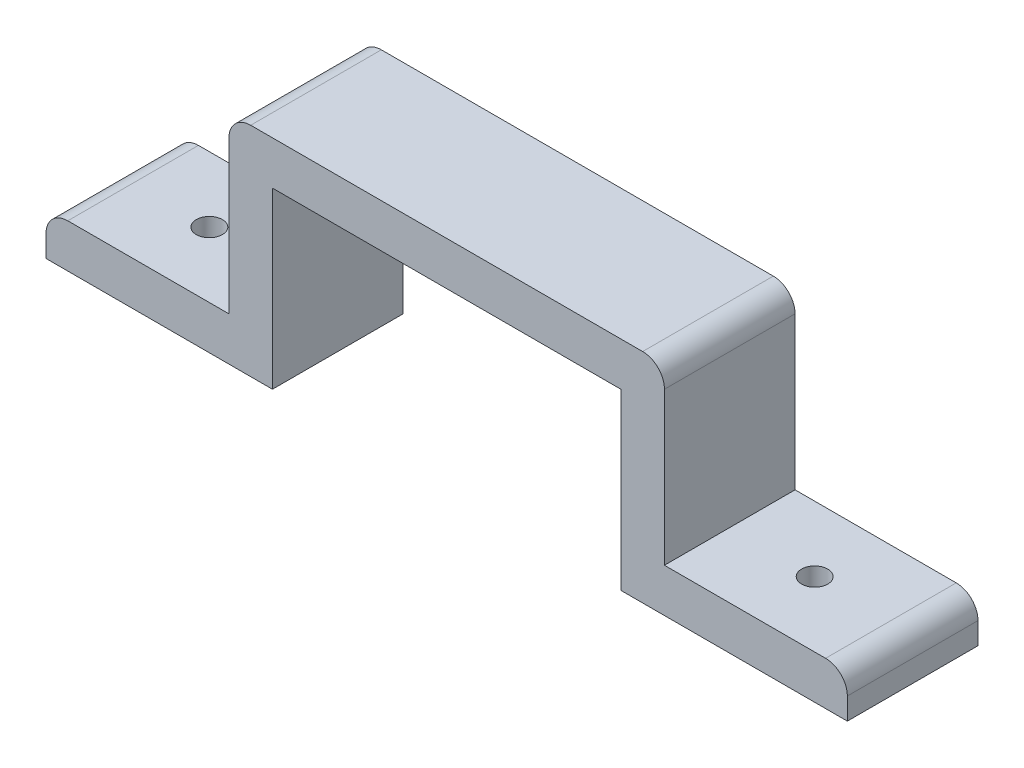
ISO-10303-21;
HEADER;
FILE_DESCRIPTION(('STEP AP214'),'2;1');
FILE_NAME('part.step','',(''),(''),'','','');
FILE_SCHEMA(('AUTOMOTIVE_DESIGN { 1 0 10303 214 1 1 1 1 }'));
ENDSEC;
DATA;
#1=APPLICATION_CONTEXT('core data for automotive mechanical design processes');
#2=APPLICATION_PROTOCOL_DEFINITION('international standard','automotive_design',2000,#1);
#3=PRODUCT_CONTEXT('',#1,'mechanical');
#4=PRODUCT('Part','Part','',(#3));
#5=PRODUCT_RELATED_PRODUCT_CATEGORY('part','',(#4));
#6=PRODUCT_DEFINITION_FORMATION('','',#4);
#7=PRODUCT_DEFINITION_CONTEXT('part definition',#1,'design');
#8=PRODUCT_DEFINITION('design','',#6,#7);
#9=PRODUCT_DEFINITION_SHAPE('','',#8);
#10=(LENGTH_UNIT() NAMED_UNIT(*) SI_UNIT(.MILLI.,.METRE.));
#11=(NAMED_UNIT(*) PLANE_ANGLE_UNIT() SI_UNIT($,.RADIAN.));
#12=(NAMED_UNIT(*) SI_UNIT($,.STERADIAN.) SOLID_ANGLE_UNIT());
#13=UNCERTAINTY_MEASURE_WITH_UNIT(LENGTH_MEASURE(1.E-05),#10,'distance_accuracy_value','');
#14=(GEOMETRIC_REPRESENTATION_CONTEXT(3) GLOBAL_UNCERTAINTY_ASSIGNED_CONTEXT((#13)) GLOBAL_UNIT_ASSIGNED_CONTEXT((#10,
#11,#12)) REPRESENTATION_CONTEXT('',''));
#15=CARTESIAN_POINT('',(0.,0.,0.));
#16=DIRECTION('',(0.,0.,1.));
#17=DIRECTION('',(1.,0.,0.));
#18=AXIS2_PLACEMENT_3D('',#15,#16,#17);
#19=CARTESIAN_POINT('',(-25.,5.,15.));
#20=DIRECTION('',(1.,0.,0.));
#21=DIRECTION('',(0.,0.,-1.));
#22=AXIS2_PLACEMENT_3D('',#19,#20,#21);
#23=PLANE('',#22);
#24=DIRECTION('',(0.,-1.,0.));
#25=VECTOR('',#24,1.);
#26=CARTESIAN_POINT('',(-25.,5.,15.));
#27=LINE('',#26,#25);
#28=CARTESIAN_POINT('',(-25.,22.5,15.));
#29=VERTEX_POINT('',#28);
#30=CARTESIAN_POINT('',(-25.,5.,15.));
#31=VERTEX_POINT('',#30);
#32=EDGE_CURVE('E147',#29,#31,#27,.T.);
#33=ORIENTED_EDGE('',*,*,#32,.F.);
#34=DIRECTION('',(0.,0.,-1.));
#35=VECTOR('',#34,1.);
#36=CARTESIAN_POINT('',(-25.,22.5,15.));
#37=LINE('',#36,#35);
#38=CARTESIAN_POINT('',(-25.,22.5,0.));
#39=VERTEX_POINT('',#38);
#40=EDGE_CURVE('E173',#29,#39,#37,.T.);
#41=ORIENTED_EDGE('',*,*,#40,.T.);
#42=DIRECTION('',(0.,-1.,0.));
#43=VECTOR('',#42,1.);
#44=CARTESIAN_POINT('',(-25.,5.,0.));
#45=LINE('',#44,#43);
#46=CARTESIAN_POINT('',(-25.,5.,0.));
#47=VERTEX_POINT('',#46);
#48=EDGE_CURVE('E171',#39,#47,#45,.T.);
#49=ORIENTED_EDGE('',*,*,#48,.T.);
#50=DIRECTION('',(0.,0.,-1.));
#51=VECTOR('',#50,1.);
#52=CARTESIAN_POINT('',(-25.,5.,15.));
#53=LINE('',#52,#51);
#54=EDGE_CURVE('E165',#31,#47,#53,.T.);
#55=ORIENTED_EDGE('',*,*,#54,.F.);
#56=EDGE_LOOP('',(#33,#41,#49,#55));
#57=FACE_BOUND('',#56,.T.);
#58=ADVANCED_FACE('F33',(#57),#23,.F.);
#59=CARTESIAN_POINT('',(-46.,5.,15.));
#60=DIRECTION('',(0.,-1.,0.));
#61=DIRECTION('',(0.,0.,-1.));
#62=AXIS2_PLACEMENT_3D('',#59,#60,#61);
#63=PLANE('',#62);
#64=CARTESIAN_POINT('',(-34.75,5.,7.5));
#65=DIRECTION('',(0.,1.,0.));
#66=DIRECTION('',(0.,0.,-1.));
#67=AXIS2_PLACEMENT_3D('',#64,#65,#66);
#68=CIRCLE('',#67,1.5);
#69=CARTESIAN_POINT('',(-34.75,5.,6.));
#70=VERTEX_POINT('',#69);
#71=EDGE_CURVE('E376',#70,#70,#68,.T.);
#72=ORIENTED_EDGE('',*,*,#71,.F.);
#73=EDGE_LOOP('',(#72));
#74=FACE_BOUND('',#73,.T.);
#75=DIRECTION('',(-1.,0.,0.));
#76=VECTOR('',#75,1.);
#77=CARTESIAN_POINT('',(-46.,5.,0.));
#78=LINE('',#77,#76);
#79=CARTESIAN_POINT('',(-43.5,5.,0.));
#80=VERTEX_POINT('',#79);
#81=EDGE_CURVE('E290',#47,#80,#78,.T.);
#82=ORIENTED_EDGE('',*,*,#81,.T.);
#83=DIRECTION('',(0.,0.,-1.));
#84=VECTOR('',#83,1.);
#85=CARTESIAN_POINT('',(-43.5,5.,15.));
#86=LINE('',#85,#84);
#87=CARTESIAN_POINT('',(-43.5,5.,15.));
#88=VERTEX_POINT('',#87);
#89=EDGE_CURVE('E167',#80,#88,#86,.F.);
#90=ORIENTED_EDGE('',*,*,#89,.T.);
#91=DIRECTION('',(-1.,0.,0.));
#92=VECTOR('',#91,1.);
#93=CARTESIAN_POINT('',(-46.,5.,15.));
#94=LINE('',#93,#92);
#95=EDGE_CURVE('E151',#31,#88,#94,.T.);
#96=ORIENTED_EDGE('',*,*,#95,.F.);
#97=ORIENTED_EDGE('',*,*,#54,.T.);
#98=EDGE_LOOP('',(#82,#90,#96,#97));
#99=FACE_BOUND('',#98,.T.);
#100=ADVANCED_FACE('F164',(#74,#99),#63,.F.);
#101=CARTESIAN_POINT('',(-46.,0.,15.));
#102=DIRECTION('',(1.,0.,0.));
#103=DIRECTION('',(0.,0.,-1.));
#104=AXIS2_PLACEMENT_3D('',#101,#102,#103);
#105=PLANE('',#104);
#106=DIRECTION('',(0.,-1.,0.));
#107=VECTOR('',#106,1.);
#108=CARTESIAN_POINT('',(-46.,0.,15.));
#109=LINE('',#108,#107);
#110=CARTESIAN_POINT('',(-46.,2.5,15.));
#111=VERTEX_POINT('',#110);
#112=CARTESIAN_POINT('',(-46.,0.,15.));
#113=VERTEX_POINT('',#112);
#114=EDGE_CURVE('E168',#111,#113,#109,.T.);
#115=ORIENTED_EDGE('',*,*,#114,.F.);
#116=DIRECTION('',(0.,0.,-1.));
#117=VECTOR('',#116,1.);
#118=CARTESIAN_POINT('',(-46.,2.5,15.));
#119=LINE('',#118,#117);
#120=CARTESIAN_POINT('',(-46.,2.5,0.));
#121=VERTEX_POINT('',#120);
#122=EDGE_CURVE('E202',#111,#121,#119,.T.);
#123=ORIENTED_EDGE('',*,*,#122,.T.);
#124=DIRECTION('',(0.,-1.,0.));
#125=VECTOR('',#124,1.);
#126=CARTESIAN_POINT('',(-46.,0.,0.));
#127=LINE('',#126,#125);
#128=CARTESIAN_POINT('',(-46.,0.,0.));
#129=VERTEX_POINT('',#128);
#130=EDGE_CURVE('E264',#121,#129,#127,.T.);
#131=ORIENTED_EDGE('',*,*,#130,.T.);
#132=DIRECTION('',(0.,0.,-1.));
#133=VECTOR('',#132,1.);
#134=CARTESIAN_POINT('',(-46.,0.,15.));
#135=LINE('',#134,#133);
#136=EDGE_CURVE('E174',#113,#129,#135,.T.);
#137=ORIENTED_EDGE('',*,*,#136,.F.);
#138=EDGE_LOOP('',(#115,#123,#131,#137));
#139=FACE_BOUND('',#138,.T.);
#140=ADVANCED_FACE('F295',(#139),#105,.F.);
#141=CARTESIAN_POINT('',(-20.,0.,15.));
#142=DIRECTION('',(0.,1.,0.));
#143=DIRECTION('',(0.,0.,1.));
#144=AXIS2_PLACEMENT_3D('',#141,#142,#143);
#145=PLANE('',#144);
#146=CARTESIAN_POINT('',(-34.75,0.,7.5));
#147=DIRECTION('',(0.,1.,0.));
#148=DIRECTION('',(0.,0.,1.));
#149=AXIS2_PLACEMENT_3D('',#146,#147,#148);
#150=CIRCLE('',#149,1.5);
#151=CARTESIAN_POINT('',(-34.75,0.,9.00000000000001));
#152=VERTEX_POINT('',#151);
#153=EDGE_CURVE('E373',#152,#152,#150,.F.);
#154=ORIENTED_EDGE('',*,*,#153,.F.);
#155=EDGE_LOOP('',(#154));
#156=FACE_BOUND('',#155,.T.);
#157=DIRECTION('',(1.,0.,0.));
#158=VECTOR('',#157,1.);
#159=CARTESIAN_POINT('',(-20.,0.,0.));
#160=LINE('',#159,#158);
#161=CARTESIAN_POINT('',(-20.,0.,0.));
#162=VERTEX_POINT('',#161);
#163=EDGE_CURVE('E258',#129,#162,#160,.T.);
#164=ORIENTED_EDGE('',*,*,#163,.T.);
#165=DIRECTION('',(0.,0.,-1.));
#166=VECTOR('',#165,1.);
#167=CARTESIAN_POINT('',(-20.,0.,15.));
#168=LINE('',#167,#166);
#169=CARTESIAN_POINT('',(-20.,0.,15.));
#170=VERTEX_POINT('',#169);
#171=EDGE_CURVE('E179',#170,#162,#168,.T.);
#172=ORIENTED_EDGE('',*,*,#171,.F.);
#173=DIRECTION('',(1.,0.,0.));
#174=VECTOR('',#173,1.);
#175=CARTESIAN_POINT('',(-20.,0.,15.));
#176=LINE('',#175,#174);
#177=EDGE_CURVE('E298',#113,#170,#176,.T.);
#178=ORIENTED_EDGE('',*,*,#177,.F.);
#179=ORIENTED_EDGE('',*,*,#136,.T.);
#180=EDGE_LOOP('',(#164,#172,#178,#179));
#181=FACE_BOUND('',#180,.T.);
#182=ADVANCED_FACE('F297',(#156,#181),#145,.F.);
#183=CARTESIAN_POINT('',(-20.,20.,15.));
#184=DIRECTION('',(-1.,0.,0.));
#185=DIRECTION('',(0.,-1.,0.));
#186=AXIS2_PLACEMENT_3D('',#183,#184,#185);
#187=PLANE('',#186);
#188=DIRECTION('',(0.,1.,0.));
#189=VECTOR('',#188,1.);
#190=CARTESIAN_POINT('',(-20.,20.,0.));
#191=LINE('',#190,#189);
#192=CARTESIAN_POINT('',(-20.,20.,0.));
#193=VERTEX_POINT('',#192);
#194=EDGE_CURVE('E251',#162,#193,#191,.T.);
#195=ORIENTED_EDGE('',*,*,#194,.T.);
#196=DIRECTION('',(0.,0.,-1.));
#197=VECTOR('',#196,1.);
#198=CARTESIAN_POINT('',(-20.,20.,15.));
#199=LINE('',#198,#197);
#200=CARTESIAN_POINT('',(-20.,20.,15.));
#201=VERTEX_POINT('',#200);
#202=EDGE_CURVE('E242',#201,#193,#199,.T.);
#203=ORIENTED_EDGE('',*,*,#202,.F.);
#204=DIRECTION('',(0.,1.,0.));
#205=VECTOR('',#204,1.);
#206=CARTESIAN_POINT('',(-20.,20.,15.));
#207=LINE('',#206,#205);
#208=EDGE_CURVE('E252',#170,#201,#207,.T.);
#209=ORIENTED_EDGE('',*,*,#208,.F.);
#210=ORIENTED_EDGE('',*,*,#171,.T.);
#211=EDGE_LOOP('',(#195,#203,#209,#210));
#212=FACE_BOUND('',#211,.T.);
#213=ADVANCED_FACE('F249',(#212),#187,.F.);
#214=CARTESIAN_POINT('',(20.,20.,15.));
#215=DIRECTION('',(0.,1.,0.));
#216=DIRECTION('',(0.,0.,1.));
#217=AXIS2_PLACEMENT_3D('',#214,#215,#216);
#218=PLANE('',#217);
#219=DIRECTION('',(1.,0.,0.));
#220=VECTOR('',#219,1.);
#221=CARTESIAN_POINT('',(20.,20.,0.));
#222=LINE('',#221,#220);
#223=CARTESIAN_POINT('',(20.,20.,0.));
#224=VERTEX_POINT('',#223);
#225=EDGE_CURVE('E260',#193,#224,#222,.T.);
#226=ORIENTED_EDGE('',*,*,#225,.T.);
#227=DIRECTION('',(0.,0.,-1.));
#228=VECTOR('',#227,1.);
#229=CARTESIAN_POINT('',(20.,20.,15.));
#230=LINE('',#229,#228);
#231=CARTESIAN_POINT('',(20.,20.,15.));
#232=VERTEX_POINT('',#231);
#233=EDGE_CURVE('E239',#232,#224,#230,.T.);
#234=ORIENTED_EDGE('',*,*,#233,.F.);
#235=DIRECTION('',(1.,0.,0.));
#236=VECTOR('',#235,1.);
#237=CARTESIAN_POINT('',(20.,20.,15.));
#238=LINE('',#237,#236);
#239=EDGE_CURVE('E300',#201,#232,#238,.T.);
#240=ORIENTED_EDGE('',*,*,#239,.F.);
#241=ORIENTED_EDGE('',*,*,#202,.T.);
#242=EDGE_LOOP('',(#226,#234,#240,#241));
#243=FACE_BOUND('',#242,.T.);
#244=ADVANCED_FACE('F310',(#243),#218,.F.);
#245=CARTESIAN_POINT('',(20.,20.,15.));
#246=DIRECTION('',(1.,0.,0.));
#247=DIRECTION('',(0.,1.,0.));
#248=AXIS2_PLACEMENT_3D('',#245,#246,#247);
#249=PLANE('',#248);
#250=DIRECTION('',(0.,-1.,0.));
#251=VECTOR('',#250,1.);
#252=CARTESIAN_POINT('',(20.,20.,0.));
#253=LINE('',#252,#251);
#254=CARTESIAN_POINT('',(20.,0.,0.));
#255=VERTEX_POINT('',#254);
#256=EDGE_CURVE('E262',#224,#255,#253,.T.);
#257=ORIENTED_EDGE('',*,*,#256,.T.);
#258=DIRECTION('',(0.,0.,-1.));
#259=VECTOR('',#258,1.);
#260=CARTESIAN_POINT('',(20.,0.,15.));
#261=LINE('',#260,#259);
#262=CARTESIAN_POINT('',(20.,0.,15.));
#263=VERTEX_POINT('',#262);
#264=EDGE_CURVE('E236',#263,#255,#261,.T.);
#265=ORIENTED_EDGE('',*,*,#264,.F.);
#266=DIRECTION('',(0.,-1.,0.));
#267=VECTOR('',#266,1.);
#268=CARTESIAN_POINT('',(20.,20.,15.));
#269=LINE('',#268,#267);
#270=EDGE_CURVE('E283',#232,#263,#269,.T.);
#271=ORIENTED_EDGE('',*,*,#270,.F.);
#272=ORIENTED_EDGE('',*,*,#233,.T.);
#273=EDGE_LOOP('',(#257,#265,#271,#272));
#274=FACE_BOUND('',#273,.T.);
#275=ADVANCED_FACE('F308',(#274),#249,.F.);
#276=CARTESIAN_POINT('',(20.,0.,15.));
#277=DIRECTION('',(0.,1.,0.));
#278=DIRECTION('',(0.,0.,1.));
#279=AXIS2_PLACEMENT_3D('',#276,#277,#278);
#280=PLANE('',#279);
#281=CARTESIAN_POINT('',(34.75,0.,7.5));
#282=DIRECTION('',(0.,1.,0.));
#283=DIRECTION('',(0.,0.,1.));
#284=AXIS2_PLACEMENT_3D('',#281,#282,#283);
#285=CIRCLE('',#284,1.5);
#286=CARTESIAN_POINT('',(34.75,0.,9.00000000000001));
#287=VERTEX_POINT('',#286);
#288=EDGE_CURVE('E291',#287,#287,#285,.F.);
#289=ORIENTED_EDGE('',*,*,#288,.F.);
#290=EDGE_LOOP('',(#289));
#291=FACE_BOUND('',#290,.T.);
#292=DIRECTION('',(1.,0.,0.));
#293=VECTOR('',#292,1.);
#294=CARTESIAN_POINT('',(20.,0.,0.));
#295=LINE('',#294,#293);
#296=CARTESIAN_POINT('',(46.,0.,0.));
#297=VERTEX_POINT('',#296);
#298=EDGE_CURVE('E224',#255,#297,#295,.T.);
#299=ORIENTED_EDGE('',*,*,#298,.T.);
#300=DIRECTION('',(0.,0.,-1.));
#301=VECTOR('',#300,1.);
#302=CARTESIAN_POINT('',(46.,0.,15.));
#303=LINE('',#302,#301);
#304=CARTESIAN_POINT('',(46.,0.,15.));
#305=VERTEX_POINT('',#304);
#306=EDGE_CURVE('E232',#305,#297,#303,.T.);
#307=ORIENTED_EDGE('',*,*,#306,.F.);
#308=DIRECTION('',(1.,0.,0.));
#309=VECTOR('',#308,1.);
#310=CARTESIAN_POINT('',(20.,0.,15.));
#311=LINE('',#310,#309);
#312=EDGE_CURVE('E279',#263,#305,#311,.T.);
#313=ORIENTED_EDGE('',*,*,#312,.F.);
#314=ORIENTED_EDGE('',*,*,#264,.T.);
#315=EDGE_LOOP('',(#299,#307,#313,#314));
#316=FACE_BOUND('',#315,.T.);
#317=ADVANCED_FACE('F271',(#291,#316),#280,.F.);
#318=CARTESIAN_POINT('',(46.,0.,15.));
#319=DIRECTION('',(-1.,0.,0.));
#320=DIRECTION('',(0.,0.,1.));
#321=AXIS2_PLACEMENT_3D('',#318,#319,#320);
#322=PLANE('',#321);
#323=DIRECTION('',(0.,1.,0.));
#324=VECTOR('',#323,1.);
#325=CARTESIAN_POINT('',(46.,0.,0.));
#326=LINE('',#325,#324);
#327=CARTESIAN_POINT('',(46.,2.5,0.));
#328=VERTEX_POINT('',#327);
#329=EDGE_CURVE('E221',#297,#328,#326,.T.);
#330=ORIENTED_EDGE('',*,*,#329,.T.);
#331=DIRECTION('',(0.,0.,-1.));
#332=VECTOR('',#331,1.);
#333=CARTESIAN_POINT('',(46.,2.5,15.));
#334=LINE('',#333,#332);
#335=CARTESIAN_POINT('',(46.,2.5,15.));
#336=VERTEX_POINT('',#335);
#337=EDGE_CURVE('E11',#328,#336,#334,.F.);
#338=ORIENTED_EDGE('',*,*,#337,.T.);
#339=DIRECTION('',(0.,1.,0.));
#340=VECTOR('',#339,1.);
#341=CARTESIAN_POINT('',(46.,0.,15.));
#342=LINE('',#341,#340);
#343=EDGE_CURVE('E278',#305,#336,#342,.T.);
#344=ORIENTED_EDGE('',*,*,#343,.F.);
#345=ORIENTED_EDGE('',*,*,#306,.T.);
#346=EDGE_LOOP('',(#330,#338,#344,#345));
#347=FACE_BOUND('',#346,.T.);
#348=ADVANCED_FACE('F276',(#347),#322,.F.);
#349=CARTESIAN_POINT('',(46.,5.,15.));
#350=DIRECTION('',(0.,-1.,0.));
#351=DIRECTION('',(0.,0.,-1.));
#352=AXIS2_PLACEMENT_3D('',#349,#350,#351);
#353=PLANE('',#352);
#354=CARTESIAN_POINT('',(34.75,5.,7.5));
#355=DIRECTION('',(0.,1.,0.));
#356=DIRECTION('',(0.,0.,1.));
#357=AXIS2_PLACEMENT_3D('',#354,#355,#356);
#358=CIRCLE('',#357,1.5);
#359=CARTESIAN_POINT('',(34.75,5.,9.00000000000001));
#360=VERTEX_POINT('',#359);
#361=EDGE_CURVE('E370',#360,#360,#358,.T.);
#362=ORIENTED_EDGE('',*,*,#361,.F.);
#363=EDGE_LOOP('',(#362));
#364=FACE_BOUND('',#363,.T.);
#365=DIRECTION('',(-1.,0.,0.));
#366=VECTOR('',#365,1.);
#367=CARTESIAN_POINT('',(46.,5.,15.));
#368=LINE('',#367,#366);
#369=CARTESIAN_POINT('',(43.5,5.,15.));
#370=VERTEX_POINT('',#369);
#371=CARTESIAN_POINT('',(25.,5.,15.));
#372=VERTEX_POINT('',#371);
#373=EDGE_CURVE('E213',#370,#372,#368,.T.);
#374=ORIENTED_EDGE('',*,*,#373,.F.);
#375=DIRECTION('',(0.,0.,-1.));
#376=VECTOR('',#375,1.);
#377=CARTESIAN_POINT('',(43.5,5.,15.));
#378=LINE('',#377,#376);
#379=CARTESIAN_POINT('',(43.5,5.,0.));
#380=VERTEX_POINT('',#379);
#381=EDGE_CURVE('E41',#370,#380,#378,.T.);
#382=ORIENTED_EDGE('',*,*,#381,.T.);
#383=DIRECTION('',(-1.,0.,0.));
#384=VECTOR('',#383,1.);
#385=CARTESIAN_POINT('',(46.,5.,0.));
#386=LINE('',#385,#384);
#387=CARTESIAN_POINT('',(25.,5.,0.));
#388=VERTEX_POINT('',#387);
#389=EDGE_CURVE('E211',#380,#388,#386,.T.);
#390=ORIENTED_EDGE('',*,*,#389,.T.);
#391=DIRECTION('',(0.,0.,-1.));
#392=VECTOR('',#391,1.);
#393=CARTESIAN_POINT('',(25.,5.,15.));
#394=LINE('',#393,#392);
#395=EDGE_CURVE('E230',#372,#388,#394,.T.);
#396=ORIENTED_EDGE('',*,*,#395,.F.);
#397=EDGE_LOOP('',(#374,#382,#390,#396));
#398=FACE_BOUND('',#397,.T.);
#399=ADVANCED_FACE('F209',(#364,#398),#353,.F.);
#400=CARTESIAN_POINT('',(25.,5.,15.));
#401=DIRECTION('',(-1.,0.,0.));
#402=DIRECTION('',(0.,0.,1.));
#403=AXIS2_PLACEMENT_3D('',#400,#401,#402);
#404=PLANE('',#403);
#405=DIRECTION('',(0.,1.,0.));
#406=VECTOR('',#405,1.);
#407=CARTESIAN_POINT('',(25.,5.,0.));
#408=LINE('',#407,#406);
#409=CARTESIAN_POINT('',(25.,22.5,0.));
#410=VERTEX_POINT('',#409);
#411=EDGE_CURVE('E220',#388,#410,#408,.T.);
#412=ORIENTED_EDGE('',*,*,#411,.T.);
#413=DIRECTION('',(0.,0.,-1.));
#414=VECTOR('',#413,1.);
#415=CARTESIAN_POINT('',(25.,22.5,15.));
#416=LINE('',#415,#414);
#417=CARTESIAN_POINT('',(25.,22.5,15.));
#418=VERTEX_POINT('',#417);
#419=EDGE_CURVE('E48',#410,#418,#416,.F.);
#420=ORIENTED_EDGE('',*,*,#419,.T.);
#421=DIRECTION('',(0.,1.,0.));
#422=VECTOR('',#421,1.);
#423=CARTESIAN_POINT('',(25.,5.,15.));
#424=LINE('',#423,#422);
#425=EDGE_CURVE('E281',#372,#418,#424,.T.);
#426=ORIENTED_EDGE('',*,*,#425,.F.);
#427=ORIENTED_EDGE('',*,*,#395,.T.);
#428=EDGE_LOOP('',(#412,#420,#426,#427));
#429=FACE_BOUND('',#428,.T.);
#430=ADVANCED_FACE('F349',(#429),#404,.F.);
#431=CARTESIAN_POINT('',(-25.,25.,15.));
#432=DIRECTION('',(0.,-1.,0.));
#433=DIRECTION('',(0.,0.,-1.));
#434=AXIS2_PLACEMENT_3D('',#431,#432,#433);
#435=PLANE('',#434);
#436=DIRECTION('',(-1.,0.,0.));
#437=VECTOR('',#436,1.);
#438=CARTESIAN_POINT('',(-25.,25.,0.));
#439=LINE('',#438,#437);
#440=CARTESIAN_POINT('',(22.5,25.,0.));
#441=VERTEX_POINT('',#440);
#442=CARTESIAN_POINT('',(-22.5,25.,0.));
#443=VERTEX_POINT('',#442);
#444=EDGE_CURVE('E159',#441,#443,#439,.T.);
#445=ORIENTED_EDGE('',*,*,#444,.T.);
#446=DIRECTION('',(0.,0.,-1.));
#447=VECTOR('',#446,1.);
#448=CARTESIAN_POINT('',(-22.5,25.,15.));
#449=LINE('',#448,#447);
#450=CARTESIAN_POINT('',(-22.5,25.,15.));
#451=VERTEX_POINT('',#450);
#452=EDGE_CURVE('E193',#443,#451,#449,.F.);
#453=ORIENTED_EDGE('',*,*,#452,.T.);
#454=DIRECTION('',(-1.,0.,0.));
#455=VECTOR('',#454,1.);
#456=CARTESIAN_POINT('',(-25.,25.,15.));
#457=LINE('',#456,#455);
#458=CARTESIAN_POINT('',(22.5,25.,15.));
#459=VERTEX_POINT('',#458);
#460=EDGE_CURVE('E233',#459,#451,#457,.T.);
#461=ORIENTED_EDGE('',*,*,#460,.F.);
#462=DIRECTION('',(0.,0.,-1.));
#463=VECTOR('',#462,1.);
#464=CARTESIAN_POINT('',(22.5,25.,15.));
#465=LINE('',#464,#463);
#466=EDGE_CURVE('E190',#459,#441,#465,.T.);
#467=ORIENTED_EDGE('',*,*,#466,.T.);
#468=EDGE_LOOP('',(#445,#453,#461,#467));
#469=FACE_BOUND('',#468,.T.);
#470=ADVANCED_FACE('F345',(#469),#435,.F.);
#471=CARTESIAN_POINT('',(0.,0.,15.));
#472=DIRECTION('',(0.,0.,-1.));
#473=DIRECTION('',(-1.,0.,0.));
#474=AXIS2_PLACEMENT_3D('',#471,#472,#473);
#475=PLANE('',#474);
#476=ORIENTED_EDGE('',*,*,#460,.T.);
#477=CARTESIAN_POINT('',(-22.5,22.5,15.));
#478=DIRECTION('',(0.,0.,-1.));
#479=DIRECTION('',(-1.,0.,0.));
#480=AXIS2_PLACEMENT_3D('',#477,#478,#479);
#481=CIRCLE('',#480,2.5);
#482=EDGE_CURVE('E154',#451,#29,#481,.F.);
#483=ORIENTED_EDGE('',*,*,#482,.T.);
#484=ORIENTED_EDGE('',*,*,#32,.T.);
#485=ORIENTED_EDGE('',*,*,#95,.T.);
#486=CARTESIAN_POINT('',(-43.5,2.5,15.));
#487=DIRECTION('',(0.,0.,-1.));
#488=DIRECTION('',(-1.,0.,0.));
#489=AXIS2_PLACEMENT_3D('',#486,#487,#488);
#490=CIRCLE('',#489,2.5);
#491=EDGE_CURVE('E196',#88,#111,#490,.F.);
#492=ORIENTED_EDGE('',*,*,#491,.T.);
#493=ORIENTED_EDGE('',*,*,#114,.T.);
#494=ORIENTED_EDGE('',*,*,#177,.T.);
#495=ORIENTED_EDGE('',*,*,#208,.T.);
#496=ORIENTED_EDGE('',*,*,#239,.T.);
#497=ORIENTED_EDGE('',*,*,#270,.T.);
#498=ORIENTED_EDGE('',*,*,#312,.T.);
#499=ORIENTED_EDGE('',*,*,#343,.T.);
#500=CARTESIAN_POINT('',(43.5,2.5,15.));
#501=DIRECTION('',(0.,0.,-1.));
#502=DIRECTION('',(-1.,0.,0.));
#503=AXIS2_PLACEMENT_3D('',#500,#501,#502);
#504=CIRCLE('',#503,2.5);
#505=EDGE_CURVE('E56',#336,#370,#504,.F.);
#506=ORIENTED_EDGE('',*,*,#505,.T.);
#507=ORIENTED_EDGE('',*,*,#373,.T.);
#508=ORIENTED_EDGE('',*,*,#425,.T.);
#509=CARTESIAN_POINT('',(22.5,22.5,15.));
#510=DIRECTION('',(0.,0.,-1.));
#511=DIRECTION('',(-1.,0.,0.));
#512=AXIS2_PLACEMENT_3D('',#509,#510,#511);
#513=CIRCLE('',#512,2.5);
#514=EDGE_CURVE('E198',#418,#459,#513,.F.);
#515=ORIENTED_EDGE('',*,*,#514,.T.);
#516=EDGE_LOOP('',(#476,#483,#484,#485,#492,#493,#494,#495,#496,#497,#498,#499,#506,#507,#508,#515));
#517=FACE_BOUND('',#516,.T.);
#518=ADVANCED_FACE('F150',(#517),#475,.F.);
#519=CARTESIAN_POINT('',(0.,0.,0.));
#520=DIRECTION('',(0.,0.,-1.));
#521=DIRECTION('',(-1.,0.,0.));
#522=AXIS2_PLACEMENT_3D('',#519,#520,#521);
#523=PLANE('',#522);
#524=ORIENTED_EDGE('',*,*,#48,.F.);
#525=CARTESIAN_POINT('',(-22.5,22.5,0.));
#526=DIRECTION('',(0.,0.,-1.));
#527=DIRECTION('',(-1.,0.,0.));
#528=AXIS2_PLACEMENT_3D('',#525,#526,#527);
#529=CIRCLE('',#528,2.5);
#530=EDGE_CURVE('E188',#39,#443,#529,.T.);
#531=ORIENTED_EDGE('',*,*,#530,.T.);
#532=ORIENTED_EDGE('',*,*,#444,.F.);
#533=CARTESIAN_POINT('',(22.5,22.5,0.));
#534=DIRECTION('',(0.,0.,-1.));
#535=DIRECTION('',(-1.,0.,0.));
#536=AXIS2_PLACEMENT_3D('',#533,#534,#535);
#537=CIRCLE('',#536,2.5);
#538=EDGE_CURVE('E186',#441,#410,#537,.T.);
#539=ORIENTED_EDGE('',*,*,#538,.T.);
#540=ORIENTED_EDGE('',*,*,#411,.F.);
#541=ORIENTED_EDGE('',*,*,#389,.F.);
#542=CARTESIAN_POINT('',(43.5,2.5,0.));
#543=DIRECTION('',(0.,0.,-1.));
#544=DIRECTION('',(-1.,0.,0.));
#545=AXIS2_PLACEMENT_3D('',#542,#543,#544);
#546=CIRCLE('',#545,2.5);
#547=EDGE_CURVE('E176',#380,#328,#546,.T.);
#548=ORIENTED_EDGE('',*,*,#547,.T.);
#549=ORIENTED_EDGE('',*,*,#329,.F.);
#550=ORIENTED_EDGE('',*,*,#298,.F.);
#551=ORIENTED_EDGE('',*,*,#256,.F.);
#552=ORIENTED_EDGE('',*,*,#225,.F.);
#553=ORIENTED_EDGE('',*,*,#194,.F.);
#554=ORIENTED_EDGE('',*,*,#163,.F.);
#555=ORIENTED_EDGE('',*,*,#130,.F.);
#556=CARTESIAN_POINT('',(-43.5,2.5,0.));
#557=DIRECTION('',(0.,0.,-1.));
#558=DIRECTION('',(-1.,0.,0.));
#559=AXIS2_PLACEMENT_3D('',#556,#557,#558);
#560=CIRCLE('',#559,2.5);
#561=EDGE_CURVE('E184',#121,#80,#560,.T.);
#562=ORIENTED_EDGE('',*,*,#561,.T.);
#563=ORIENTED_EDGE('',*,*,#81,.F.);
#564=EDGE_LOOP('',(#524,#531,#532,#539,#540,#541,#548,#549,#550,#551,#552,#553,#554,#555,#562,#563));
#565=FACE_BOUND('',#564,.T.);
#566=ADVANCED_FACE('F217',(#565),#523,.T.);
#567=CARTESIAN_POINT('',(-22.5,22.5,15.));
#568=DIRECTION('',(0.,0.,-1.));
#569=DIRECTION('',(-1.,0.,0.));
#570=AXIS2_PLACEMENT_3D('',#567,#568,#569);
#571=CYLINDRICAL_SURFACE('',#570,2.5);
#572=ORIENTED_EDGE('',*,*,#482,.F.);
#573=ORIENTED_EDGE('',*,*,#452,.F.);
#574=ORIENTED_EDGE('',*,*,#530,.F.);
#575=ORIENTED_EDGE('',*,*,#40,.F.);
#576=EDGE_LOOP('',(#572,#573,#574,#575));
#577=FACE_BOUND('',#576,.T.);
#578=ADVANCED_FACE('F328',(#577),#571,.T.);
#579=CARTESIAN_POINT('',(22.5,22.5,15.));
#580=DIRECTION('',(0.,0.,-1.));
#581=DIRECTION('',(-1.,0.,0.));
#582=AXIS2_PLACEMENT_3D('',#579,#580,#581);
#583=CYLINDRICAL_SURFACE('',#582,2.5);
#584=ORIENTED_EDGE('',*,*,#514,.F.);
#585=ORIENTED_EDGE('',*,*,#419,.F.);
#586=ORIENTED_EDGE('',*,*,#538,.F.);
#587=ORIENTED_EDGE('',*,*,#466,.F.);
#588=EDGE_LOOP('',(#584,#585,#586,#587));
#589=FACE_BOUND('',#588,.T.);
#590=ADVANCED_FACE('F331',(#589),#583,.T.);
#591=CARTESIAN_POINT('',(-43.5,2.5,15.));
#592=DIRECTION('',(0.,0.,-1.));
#593=DIRECTION('',(-1.,0.,0.));
#594=AXIS2_PLACEMENT_3D('',#591,#592,#593);
#595=CYLINDRICAL_SURFACE('',#594,2.5);
#596=ORIENTED_EDGE('',*,*,#491,.F.);
#597=ORIENTED_EDGE('',*,*,#89,.F.);
#598=ORIENTED_EDGE('',*,*,#561,.F.);
#599=ORIENTED_EDGE('',*,*,#122,.F.);
#600=EDGE_LOOP('',(#596,#597,#598,#599));
#601=FACE_BOUND('',#600,.T.);
#602=ADVANCED_FACE('F334',(#601),#595,.T.);
#603=CARTESIAN_POINT('',(43.5,2.5,15.));
#604=DIRECTION('',(0.,0.,-1.));
#605=DIRECTION('',(-1.,0.,0.));
#606=AXIS2_PLACEMENT_3D('',#603,#604,#605);
#607=CYLINDRICAL_SURFACE('',#606,2.5);
#608=ORIENTED_EDGE('',*,*,#505,.F.);
#609=ORIENTED_EDGE('',*,*,#337,.F.);
#610=ORIENTED_EDGE('',*,*,#547,.F.);
#611=ORIENTED_EDGE('',*,*,#381,.F.);
#612=EDGE_LOOP('',(#608,#609,#610,#611));
#613=FACE_BOUND('',#612,.T.);
#614=ADVANCED_FACE('F35',(#613),#607,.T.);
#615=CARTESIAN_POINT('',(34.75,-4.24264068711929,7.5));
#616=DIRECTION('',(0.,1.,0.));
#617=DIRECTION('',(0.,0.,1.));
#618=AXIS2_PLACEMENT_3D('',#615,#616,#617);
#619=CYLINDRICAL_SURFACE('',#618,1.5);
#620=ORIENTED_EDGE('',*,*,#288,.T.);
#621=EDGE_LOOP('',(#620));
#622=FACE_BOUND('',#621,.T.);
#623=ORIENTED_EDGE('',*,*,#361,.T.);
#624=EDGE_LOOP('',(#623));
#625=FACE_BOUND('',#624,.T.);
#626=ADVANCED_FACE('F341',(#622,#625),#619,.F.);
#627=CARTESIAN_POINT('',(-34.75,-4.24264068711929,7.5));
#628=DIRECTION('',(0.,1.,0.));
#629=DIRECTION('',(0.,0.,1.));
#630=AXIS2_PLACEMENT_3D('',#627,#628,#629);
#631=CYLINDRICAL_SURFACE('',#630,1.5);
#632=ORIENTED_EDGE('',*,*,#153,.T.);
#633=EDGE_LOOP('',(#632));
#634=FACE_BOUND('',#633,.T.);
#635=ORIENTED_EDGE('',*,*,#71,.T.);
#636=EDGE_LOOP('',(#635));
#637=FACE_BOUND('',#636,.T.);
#638=ADVANCED_FACE('F382',(#634,#637),#631,.F.);
#639=CLOSED_SHELL('',(#58,#100,#140,#182,#213,#244,#275,#317,#348,#399,#430,#470,#518,#566,#578,
#590,#602,#614,#626,#638));
#640=MANIFOLD_SOLID_BREP('B2',#639);
#641=ADVANCED_BREP_SHAPE_REPRESENTATION('',(#18,#640),#14);
#642=SHAPE_DEFINITION_REPRESENTATION(#9,#641);
ENDSEC;
END-ISO-10303-21;
